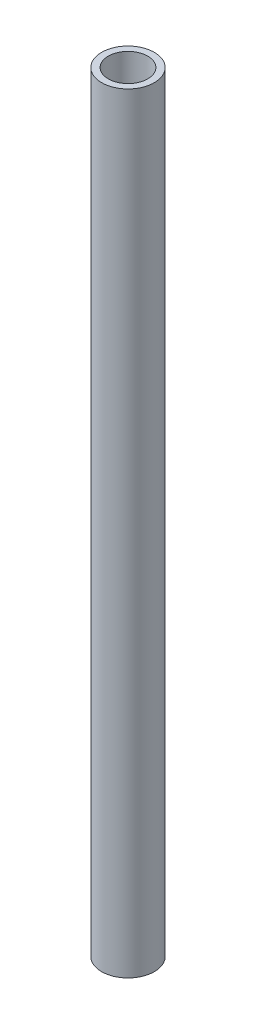
ISO-10303-21;
HEADER;
FILE_DESCRIPTION(('STEP AP214'),'2;1');
FILE_NAME('part.step','',(''),(''),'','','');
FILE_SCHEMA(('AUTOMOTIVE_DESIGN { 1 0 10303 214 1 1 1 1 }'));
ENDSEC;
DATA;
#1=APPLICATION_CONTEXT('core data for automotive mechanical design processes');
#2=APPLICATION_PROTOCOL_DEFINITION('international standard','automotive_design',2000,#1);
#3=PRODUCT_CONTEXT('',#1,'mechanical');
#4=PRODUCT('Part','Part','',(#3));
#5=PRODUCT_RELATED_PRODUCT_CATEGORY('part','',(#4));
#6=PRODUCT_DEFINITION_FORMATION('','',#4);
#7=PRODUCT_DEFINITION_CONTEXT('part definition',#1,'design');
#8=PRODUCT_DEFINITION('design','',#6,#7);
#9=PRODUCT_DEFINITION_SHAPE('','',#8);
#10=(LENGTH_UNIT() NAMED_UNIT(*) SI_UNIT(.MILLI.,.METRE.));
#11=(NAMED_UNIT(*) PLANE_ANGLE_UNIT() SI_UNIT($,.RADIAN.));
#12=(NAMED_UNIT(*) SI_UNIT($,.STERADIAN.) SOLID_ANGLE_UNIT());
#13=UNCERTAINTY_MEASURE_WITH_UNIT(LENGTH_MEASURE(1.E-05),#10,'distance_accuracy_value','');
#14=(GEOMETRIC_REPRESENTATION_CONTEXT(3) GLOBAL_UNCERTAINTY_ASSIGNED_CONTEXT((#13)) GLOBAL_UNIT_ASSIGNED_CONTEXT((#10,
#11,#12)) REPRESENTATION_CONTEXT('',''));
#15=CARTESIAN_POINT('',(0.,0.,0.));
#16=DIRECTION('',(0.,0.,1.));
#17=DIRECTION('',(1.,0.,0.));
#18=AXIS2_PLACEMENT_3D('',#15,#16,#17);
#19=CARTESIAN_POINT('',(0.,117.,0.));
#20=DIRECTION('',(0.,1.,0.));
#21=DIRECTION('',(0.,0.,1.));
#22=AXIS2_PLACEMENT_3D('',#19,#20,#21);
#23=PLANE('',#22);
#24=CARTESIAN_POINT('',(0.,117.,0.));
#25=DIRECTION('',(0.,1.,0.));
#26=DIRECTION('',(0.,0.,1.));
#27=AXIS2_PLACEMENT_3D('',#24,#25,#26);
#28=CIRCLE('',#27,4.);
#29=CARTESIAN_POINT('',(0.,117.,4.));
#30=VERTEX_POINT('',#29);
#31=EDGE_CURVE('E10',#30,#30,#28,.T.);
#32=ORIENTED_EDGE('',*,*,#31,.T.);
#33=EDGE_LOOP('',(#32));
#34=FACE_BOUND('',#33,.T.);
#35=CARTESIAN_POINT('',(0.,117.,0.));
#36=DIRECTION('',(0.,1.,0.));
#37=DIRECTION('',(0.,0.,1.));
#38=AXIS2_PLACEMENT_3D('',#35,#36,#37);
#39=CIRCLE('',#38,3.);
#40=CARTESIAN_POINT('',(0.,117.,3.));
#41=VERTEX_POINT('',#40);
#42=EDGE_CURVE('E47',#41,#41,#39,.T.);
#43=ORIENTED_EDGE('',*,*,#42,.F.);
#44=EDGE_LOOP('',(#43));
#45=FACE_BOUND('',#44,.T.);
#46=ADVANCED_FACE('F36',(#34,#45),#23,.T.);
#47=CARTESIAN_POINT('',(0.,0.,0.));
#48=DIRECTION('',(0.,1.,0.));
#49=DIRECTION('',(0.,0.,1.));
#50=AXIS2_PLACEMENT_3D('',#47,#48,#49);
#51=PLANE('',#50);
#52=CARTESIAN_POINT('',(0.,0.,0.));
#53=DIRECTION('',(0.,1.,0.));
#54=DIRECTION('',(0.,0.,1.));
#55=AXIS2_PLACEMENT_3D('',#52,#53,#54);
#56=CIRCLE('',#55,4.);
#57=CARTESIAN_POINT('',(0.,0.,4.));
#58=VERTEX_POINT('',#57);
#59=EDGE_CURVE('E40',#58,#58,#56,.T.);
#60=ORIENTED_EDGE('',*,*,#59,.F.);
#61=EDGE_LOOP('',(#60));
#62=FACE_BOUND('',#61,.T.);
#63=CARTESIAN_POINT('',(0.,0.,0.));
#64=DIRECTION('',(0.,1.,0.));
#65=DIRECTION('',(0.,0.,1.));
#66=AXIS2_PLACEMENT_3D('',#63,#64,#65);
#67=CIRCLE('',#66,3.);
#68=CARTESIAN_POINT('',(0.,0.,3.));
#69=VERTEX_POINT('',#68);
#70=EDGE_CURVE('E49',#69,#69,#67,.T.);
#71=ORIENTED_EDGE('',*,*,#70,.T.);
#72=EDGE_LOOP('',(#71));
#73=FACE_BOUND('',#72,.T.);
#74=ADVANCED_FACE('F59',(#62,#73),#51,.F.);
#75=CARTESIAN_POINT('',(0.,117.,0.));
#76=DIRECTION('',(0.,-1.,0.));
#77=DIRECTION('',(0.,0.,-1.));
#78=AXIS2_PLACEMENT_3D('',#75,#76,#77);
#79=CYLINDRICAL_SURFACE('',#78,4.);
#80=ORIENTED_EDGE('',*,*,#31,.F.);
#81=EDGE_LOOP('',(#80));
#82=FACE_BOUND('',#81,.T.);
#83=ORIENTED_EDGE('',*,*,#59,.T.);
#84=EDGE_LOOP('',(#83));
#85=FACE_BOUND('',#84,.T.);
#86=ADVANCED_FACE('F38',(#82,#85),#79,.T.);
#87=CARTESIAN_POINT('',(0.,117.,0.));
#88=DIRECTION('',(0.,-1.,0.));
#89=DIRECTION('',(0.,0.,-1.));
#90=AXIS2_PLACEMENT_3D('',#87,#88,#89);
#91=CYLINDRICAL_SURFACE('',#90,3.);
#92=ORIENTED_EDGE('',*,*,#42,.T.);
#93=EDGE_LOOP('',(#92));
#94=FACE_BOUND('',#93,.T.);
#95=ORIENTED_EDGE('',*,*,#70,.F.);
#96=EDGE_LOOP('',(#95));
#97=FACE_BOUND('',#96,.T.);
#98=ADVANCED_FACE('F55',(#94,#97),#91,.F.);
#99=CLOSED_SHELL('',(#46,#74,#86,#98));
#100=MANIFOLD_SOLID_BREP('B2',#99);
#101=ADVANCED_BREP_SHAPE_REPRESENTATION('',(#18,#100),#14);
#102=SHAPE_DEFINITION_REPRESENTATION(#9,#101);
ENDSEC;
END-ISO-10303-21;
